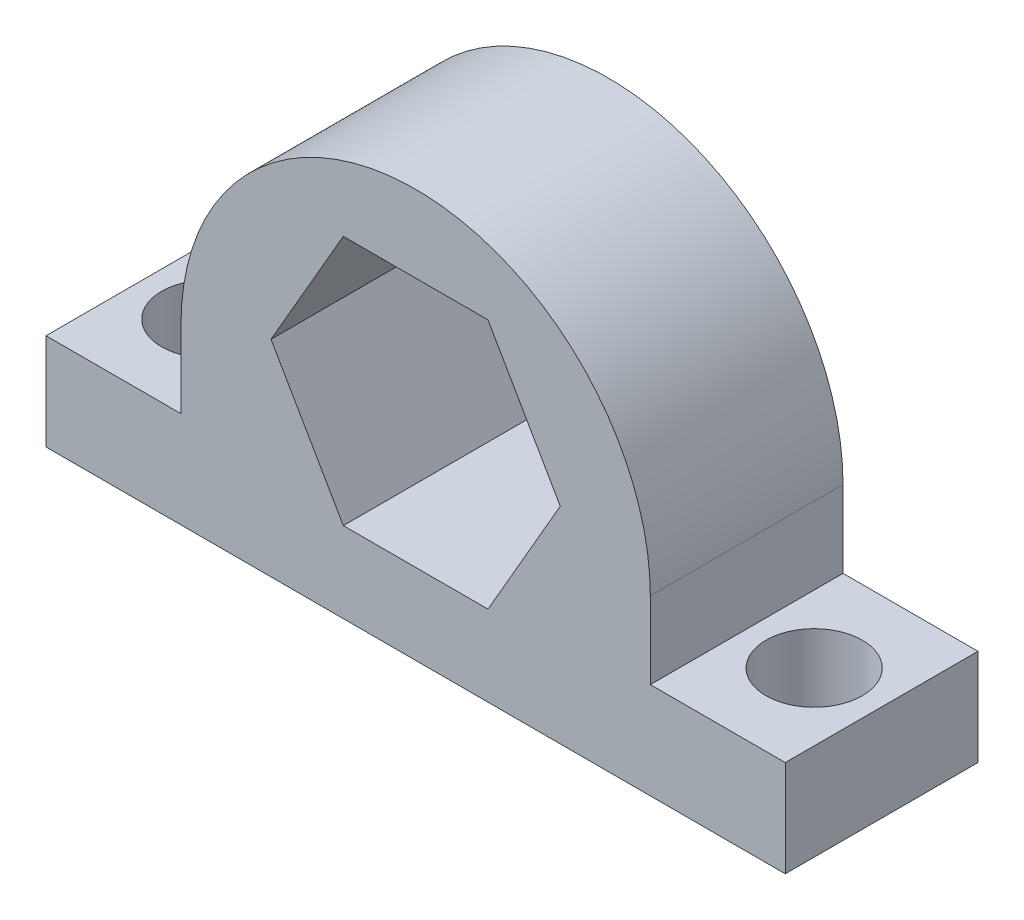
ISO-10303-21;
HEADER;
FILE_DESCRIPTION(('STEP AP214'),'2;1');
FILE_NAME('part.step','',(''),(''),'','','');
FILE_SCHEMA(('AUTOMOTIVE_DESIGN { 1 0 10303 214 1 1 1 1 }'));
ENDSEC;
DATA;
#1=APPLICATION_CONTEXT('core data for automotive mechanical design processes');
#2=APPLICATION_PROTOCOL_DEFINITION('international standard','automotive_design',2000,#1);
#3=PRODUCT_CONTEXT('',#1,'mechanical');
#4=PRODUCT('Part','Part','',(#3));
#5=PRODUCT_RELATED_PRODUCT_CATEGORY('part','',(#4));
#6=PRODUCT_DEFINITION_FORMATION('','',#4);
#7=PRODUCT_DEFINITION_CONTEXT('part definition',#1,'design');
#8=PRODUCT_DEFINITION('design','',#6,#7);
#9=PRODUCT_DEFINITION_SHAPE('','',#8);
#10=(LENGTH_UNIT() NAMED_UNIT(*) SI_UNIT(.MILLI.,.METRE.));
#11=(NAMED_UNIT(*) PLANE_ANGLE_UNIT() SI_UNIT($,.RADIAN.));
#12=(NAMED_UNIT(*) SI_UNIT($,.STERADIAN.) SOLID_ANGLE_UNIT());
#13=UNCERTAINTY_MEASURE_WITH_UNIT(LENGTH_MEASURE(1.E-05),#10,'distance_accuracy_value','');
#14=(GEOMETRIC_REPRESENTATION_CONTEXT(3) GLOBAL_UNCERTAINTY_ASSIGNED_CONTEXT((#13)) GLOBAL_UNIT_ASSIGNED_CONTEXT((#10,
#11,#12)) REPRESENTATION_CONTEXT('',''));
#15=CARTESIAN_POINT('',(0.,0.,0.));
#16=DIRECTION('',(0.,0.,1.));
#17=DIRECTION('',(1.,0.,0.));
#18=AXIS2_PLACEMENT_3D('',#15,#16,#17);
#19=CARTESIAN_POINT('',(0.,8.99563839901746,10.));
#20=DIRECTION('',(0.,0.,-1.));
#21=DIRECTION('',(-1.,0.,0.));
#22=AXIS2_PLACEMENT_3D('',#19,#20,#21);
#23=PLANE('',#22);
#24=DIRECTION('',(1.,0.,0.));
#25=VECTOR('',#24,1.);
#26=CARTESIAN_POINT('',(16.,0.,10.));
#27=LINE('',#26,#25);
#28=CARTESIAN_POINT('',(-19.18,0.,10.));
#29=VERTEX_POINT('',#28);
#30=CARTESIAN_POINT('',(19.18,0.,10.));
#31=VERTEX_POINT('',#30);
#32=EDGE_CURVE('E196',#29,#31,#27,.T.);
#33=ORIENTED_EDGE('',*,*,#32,.T.);
#34=DIRECTION('',(0.,1.,0.));
#35=VECTOR('',#34,1.);
#36=CARTESIAN_POINT('',(19.18,5.,10.));
#37=LINE('',#36,#35);
#38=CARTESIAN_POINT('',(19.18,5.,10.));
#39=VERTEX_POINT('',#38);
#40=EDGE_CURVE('E199',#31,#39,#37,.T.);
#41=ORIENTED_EDGE('',*,*,#40,.T.);
#42=DIRECTION('',(-1.,0.,0.));
#43=VECTOR('',#42,1.);
#44=CARTESIAN_POINT('',(16.,5.,10.));
#45=LINE('',#44,#43);
#46=CARTESIAN_POINT('',(12.1769911504425,5.,10.));
#47=VERTEX_POINT('',#46);
#48=EDGE_CURVE('E202',#39,#47,#45,.T.);
#49=ORIENTED_EDGE('',*,*,#48,.T.);
#50=DIRECTION('',(0.,1.,0.));
#51=VECTOR('',#50,1.);
#52=CARTESIAN_POINT('',(12.1769911504425,8.99563839901746,10.));
#53=LINE('',#52,#51);
#54=CARTESIAN_POINT('',(12.1769911504425,8.99563839901746,10.));
#55=VERTEX_POINT('',#54);
#56=EDGE_CURVE('E204',#47,#55,#53,.T.);
#57=ORIENTED_EDGE('',*,*,#56,.T.);
#58=CARTESIAN_POINT('',(0.,8.99563839901746,10.));
#59=DIRECTION('',(0.,0.,1.));
#60=DIRECTION('',(-1.,0.,0.));
#61=AXIS2_PLACEMENT_3D('',#58,#59,#60);
#62=CIRCLE('',#61,12.1769911504425);
#63=CARTESIAN_POINT('',(-12.1769911504425,8.99563839901746,10.));
#64=VERTEX_POINT('',#63);
#65=EDGE_CURVE('E206',#55,#64,#62,.T.);
#66=ORIENTED_EDGE('',*,*,#65,.T.);
#67=DIRECTION('',(0.,-1.,0.));
#68=VECTOR('',#67,1.);
#69=CARTESIAN_POINT('',(-12.1769911504425,8.99563839901746,10.));
#70=LINE('',#69,#68);
#71=CARTESIAN_POINT('',(-12.1769911504425,5.,10.));
#72=VERTEX_POINT('',#71);
#73=EDGE_CURVE('E208',#64,#72,#70,.T.);
#74=ORIENTED_EDGE('',*,*,#73,.T.);
#75=DIRECTION('',(-1.,0.,0.));
#76=VECTOR('',#75,1.);
#77=CARTESIAN_POINT('',(-16.,5.,10.));
#78=LINE('',#77,#76);
#79=CARTESIAN_POINT('',(-19.18,5.,10.));
#80=VERTEX_POINT('',#79);
#81=EDGE_CURVE('E210',#72,#80,#78,.T.);
#82=ORIENTED_EDGE('',*,*,#81,.T.);
#83=DIRECTION('',(0.,-1.,0.));
#84=VECTOR('',#83,1.);
#85=CARTESIAN_POINT('',(-19.18,0.,10.));
#86=LINE('',#85,#84);
#87=EDGE_CURVE('E212',#80,#29,#86,.T.);
#88=ORIENTED_EDGE('',*,*,#87,.T.);
#89=EDGE_LOOP('',(#33,#41,#49,#57,#66,#74,#82,#88));
#90=FACE_BOUND('',#89,.T.);
#91=DIRECTION('',(0.5,0.866025403784439,0.));
#92=VECTOR('',#91,1.);
#93=CARTESIAN_POINT('',(3.75221238938055,4.18097750080347,10.));
#94=LINE('',#93,#92);
#95=CARTESIAN_POINT('',(3.75221238938055,4.18097750080347,10.));
#96=VERTEX_POINT('',#95);
#97=CARTESIAN_POINT('',(7.5044247787611,10.68,10.));
#98=VERTEX_POINT('',#97);
#99=EDGE_CURVE('E144',#96,#98,#94,.T.);
#100=ORIENTED_EDGE('',*,*,#99,.F.);
#101=DIRECTION('',(1.,0.,0.));
#102=VECTOR('',#101,1.);
#103=CARTESIAN_POINT('',(-3.75221238938055,4.18097750080347,10.));
#104=LINE('',#103,#102);
#105=CARTESIAN_POINT('',(-3.75221238938055,4.18097750080347,10.));
#106=VERTEX_POINT('',#105);
#107=EDGE_CURVE('E174',#106,#96,#104,.T.);
#108=ORIENTED_EDGE('',*,*,#107,.F.);
#109=DIRECTION('',(0.5,-0.866025403784439,0.));
#110=VECTOR('',#109,1.);
#111=CARTESIAN_POINT('',(-7.5044247787611,10.68,10.));
#112=LINE('',#111,#110);
#113=CARTESIAN_POINT('',(-7.5044247787611,10.68,10.));
#114=VERTEX_POINT('',#113);
#115=EDGE_CURVE('E172',#114,#106,#112,.T.);
#116=ORIENTED_EDGE('',*,*,#115,.F.);
#117=DIRECTION('',(-0.5,-0.866025403784439,0.));
#118=VECTOR('',#117,1.);
#119=CARTESIAN_POINT('',(-3.75221238938055,17.1790224991965,10.));
#120=LINE('',#119,#118);
#121=CARTESIAN_POINT('',(-3.75221238938055,17.1790224991965,10.));
#122=VERTEX_POINT('',#121);
#123=EDGE_CURVE('E167',#122,#114,#120,.T.);
#124=ORIENTED_EDGE('',*,*,#123,.F.);
#125=DIRECTION('',(-1.,0.,0.));
#126=VECTOR('',#125,1.);
#127=CARTESIAN_POINT('',(3.75221238938055,17.1790224991965,10.));
#128=LINE('',#127,#126);
#129=CARTESIAN_POINT('',(3.75221238938055,17.1790224991965,10.));
#130=VERTEX_POINT('',#129);
#131=EDGE_CURVE('E165',#130,#122,#128,.T.);
#132=ORIENTED_EDGE('',*,*,#131,.F.);
#133=DIRECTION('',(-0.5,0.866025403784439,0.));
#134=VECTOR('',#133,1.);
#135=CARTESIAN_POINT('',(7.5044247787611,10.68,10.));
#136=LINE('',#135,#134);
#137=EDGE_CURVE('E152',#98,#130,#136,.T.);
#138=ORIENTED_EDGE('',*,*,#137,.F.);
#139=EDGE_LOOP('',(#100,#108,#116,#124,#132,#138));
#140=FACE_BOUND('',#139,.T.);
#141=ADVANCED_FACE('F41',(#90,#140),#23,.F.);
#142=CARTESIAN_POINT('',(0.,8.99563839901746,0.));
#143=DIRECTION('',(0.,0.,-1.));
#144=DIRECTION('',(-1.,0.,0.));
#145=AXIS2_PLACEMENT_3D('',#142,#143,#144);
#146=PLANE('',#145);
#147=DIRECTION('',(0.,1.,0.));
#148=VECTOR('',#147,1.);
#149=CARTESIAN_POINT('',(19.18,5.,0.));
#150=LINE('',#149,#148);
#151=CARTESIAN_POINT('',(19.18,0.,0.));
#152=VERTEX_POINT('',#151);
#153=CARTESIAN_POINT('',(19.18,5.,0.));
#154=VERTEX_POINT('',#153);
#155=EDGE_CURVE('E160',#152,#154,#150,.T.);
#156=ORIENTED_EDGE('',*,*,#155,.F.);
#157=DIRECTION('',(1.,0.,0.));
#158=VECTOR('',#157,1.);
#159=CARTESIAN_POINT('',(-16.,0.,0.));
#160=LINE('',#159,#158);
#161=CARTESIAN_POINT('',(-19.18,0.,0.));
#162=VERTEX_POINT('',#161);
#163=EDGE_CURVE('E200',#162,#152,#160,.T.);
#164=ORIENTED_EDGE('',*,*,#163,.F.);
#165=DIRECTION('',(0.,-1.,0.));
#166=VECTOR('',#165,1.);
#167=CARTESIAN_POINT('',(-19.18,0.,0.));
#168=LINE('',#167,#166);
#169=CARTESIAN_POINT('',(-19.18,5.,0.));
#170=VERTEX_POINT('',#169);
#171=EDGE_CURVE('E229',#170,#162,#168,.T.);
#172=ORIENTED_EDGE('',*,*,#171,.F.);
#173=DIRECTION('',(-1.,0.,0.));
#174=VECTOR('',#173,1.);
#175=CARTESIAN_POINT('',(-19.18,5.,0.));
#176=LINE('',#175,#174);
#177=CARTESIAN_POINT('',(-12.1769911504425,5.,0.));
#178=VERTEX_POINT('',#177);
#179=EDGE_CURVE('E227',#178,#170,#176,.T.);
#180=ORIENTED_EDGE('',*,*,#179,.F.);
#181=DIRECTION('',(0.,-1.,0.));
#182=VECTOR('',#181,1.);
#183=CARTESIAN_POINT('',(-12.1769911504425,8.99563839901746,0.));
#184=LINE('',#183,#182);
#185=CARTESIAN_POINT('',(-12.1769911504425,8.99563839901746,0.));
#186=VERTEX_POINT('',#185);
#187=EDGE_CURVE('E224',#186,#178,#184,.T.);
#188=ORIENTED_EDGE('',*,*,#187,.F.);
#189=CARTESIAN_POINT('',(0.,8.99563839901746,0.));
#190=DIRECTION('',(0.,0.,1.));
#191=DIRECTION('',(-1.,0.,0.));
#192=AXIS2_PLACEMENT_3D('',#189,#190,#191);
#193=CIRCLE('',#192,12.1769911504425);
#194=CARTESIAN_POINT('',(12.1769911504425,8.99563839901746,0.));
#195=VERTEX_POINT('',#194);
#196=EDGE_CURVE('E222',#195,#186,#193,.T.);
#197=ORIENTED_EDGE('',*,*,#196,.F.);
#198=DIRECTION('',(0.,1.,0.));
#199=VECTOR('',#198,1.);
#200=CARTESIAN_POINT('',(12.1769911504425,8.99563839901746,0.));
#201=LINE('',#200,#199);
#202=CARTESIAN_POINT('',(12.1769911504425,5.,0.));
#203=VERTEX_POINT('',#202);
#204=EDGE_CURVE('E220',#203,#195,#201,.T.);
#205=ORIENTED_EDGE('',*,*,#204,.F.);
#206=DIRECTION('',(-1.,0.,0.));
#207=VECTOR('',#206,1.);
#208=CARTESIAN_POINT('',(12.1769911504425,5.,0.));
#209=LINE('',#208,#207);
#210=EDGE_CURVE('E218',#154,#203,#209,.T.);
#211=ORIENTED_EDGE('',*,*,#210,.F.);
#212=EDGE_LOOP('',(#156,#164,#172,#180,#188,#197,#205,#211));
#213=FACE_BOUND('',#212,.T.);
#214=DIRECTION('',(1.,0.,0.));
#215=VECTOR('',#214,1.);
#216=CARTESIAN_POINT('',(-3.75221238938055,4.18097750080347,0.));
#217=LINE('',#216,#215);
#218=CARTESIAN_POINT('',(-3.75221238938055,4.18097750080347,0.));
#219=VERTEX_POINT('',#218);
#220=CARTESIAN_POINT('',(3.75221238938055,4.18097750080347,0.));
#221=VERTEX_POINT('',#220);
#222=EDGE_CURVE('E153',#219,#221,#217,.T.);
#223=ORIENTED_EDGE('',*,*,#222,.T.);
#224=DIRECTION('',(0.5,0.866025403784439,0.));
#225=VECTOR('',#224,1.);
#226=CARTESIAN_POINT('',(3.75221238938055,4.18097750080347,0.));
#227=LINE('',#226,#225);
#228=CARTESIAN_POINT('',(7.5044247787611,10.68,0.));
#229=VERTEX_POINT('',#228);
#230=EDGE_CURVE('E66',#221,#229,#227,.T.);
#231=ORIENTED_EDGE('',*,*,#230,.T.);
#232=DIRECTION('',(-0.5,0.866025403784439,0.));
#233=VECTOR('',#232,1.);
#234=CARTESIAN_POINT('',(7.5044247787611,10.68,0.));
#235=LINE('',#234,#233);
#236=CARTESIAN_POINT('',(3.75221238938055,17.1790224991965,0.));
#237=VERTEX_POINT('',#236);
#238=EDGE_CURVE('E159',#229,#237,#235,.T.);
#239=ORIENTED_EDGE('',*,*,#238,.T.);
#240=DIRECTION('',(-1.,0.,0.));
#241=VECTOR('',#240,1.);
#242=CARTESIAN_POINT('',(3.75221238938055,17.1790224991965,0.));
#243=LINE('',#242,#241);
#244=CARTESIAN_POINT('',(-3.75221238938055,17.1790224991965,0.));
#245=VERTEX_POINT('',#244);
#246=EDGE_CURVE('E178',#237,#245,#243,.T.);
#247=ORIENTED_EDGE('',*,*,#246,.T.);
#248=DIRECTION('',(-0.5,-0.866025403784439,0.));
#249=VECTOR('',#248,1.);
#250=CARTESIAN_POINT('',(-3.75221238938055,17.1790224991965,0.));
#251=LINE('',#250,#249);
#252=CARTESIAN_POINT('',(-7.5044247787611,10.68,0.));
#253=VERTEX_POINT('',#252);
#254=EDGE_CURVE('E181',#245,#253,#251,.T.);
#255=ORIENTED_EDGE('',*,*,#254,.T.);
#256=DIRECTION('',(0.5,-0.866025403784439,0.));
#257=VECTOR('',#256,1.);
#258=CARTESIAN_POINT('',(-7.5044247787611,10.68,0.));
#259=LINE('',#258,#257);
#260=EDGE_CURVE('E184',#253,#219,#259,.T.);
#261=ORIENTED_EDGE('',*,*,#260,.T.);
#262=EDGE_LOOP('',(#223,#231,#239,#247,#255,#261));
#263=FACE_BOUND('',#262,.T.);
#264=ADVANCED_FACE('F284',(#213,#263),#146,.T.);
#265=CARTESIAN_POINT('',(19.18,5.,10.));
#266=DIRECTION('',(-1.,0.,0.));
#267=DIRECTION('',(0.,0.,1.));
#268=AXIS2_PLACEMENT_3D('',#265,#266,#267);
#269=PLANE('',#268);
#270=ORIENTED_EDGE('',*,*,#155,.T.);
#271=DIRECTION('',(0.,0.,-1.));
#272=VECTOR('',#271,1.);
#273=CARTESIAN_POINT('',(19.18,5.,10.));
#274=LINE('',#273,#272);
#275=EDGE_CURVE('E50',#39,#154,#274,.T.);
#276=ORIENTED_EDGE('',*,*,#275,.F.);
#277=ORIENTED_EDGE('',*,*,#40,.F.);
#278=DIRECTION('',(0.,0.,-1.));
#279=VECTOR('',#278,1.);
#280=CARTESIAN_POINT('',(19.18,0.,10.));
#281=LINE('',#280,#279);
#282=EDGE_CURVE('E11',#31,#152,#281,.T.);
#283=ORIENTED_EDGE('',*,*,#282,.T.);
#284=EDGE_LOOP('',(#270,#276,#277,#283));
#285=FACE_BOUND('',#284,.T.);
#286=ADVANCED_FACE('F43',(#285),#269,.F.);
#287=CARTESIAN_POINT('',(12.1769911504425,5.,10.));
#288=DIRECTION('',(0.,-1.,0.));
#289=DIRECTION('',(0.,0.,-1.));
#290=AXIS2_PLACEMENT_3D('',#287,#288,#289);
#291=PLANE('',#290);
#292=CARTESIAN_POINT('',(15.6784955752212,5.,5.));
#293=DIRECTION('',(0.,1.,0.));
#294=DIRECTION('',(0.,0.,1.));
#295=AXIS2_PLACEMENT_3D('',#292,#293,#294);
#296=CIRCLE('',#295,2.5);
#297=CARTESIAN_POINT('',(15.6784955752212,5.,7.5));
#298=VERTEX_POINT('',#297);
#299=EDGE_CURVE('E253',#298,#298,#296,.T.);
#300=ORIENTED_EDGE('',*,*,#299,.F.);
#301=EDGE_LOOP('',(#300));
#302=FACE_BOUND('',#301,.T.);
#303=ORIENTED_EDGE('',*,*,#210,.T.);
#304=DIRECTION('',(0.,0.,-1.));
#305=VECTOR('',#304,1.);
#306=CARTESIAN_POINT('',(12.1769911504425,5.,10.));
#307=LINE('',#306,#305);
#308=EDGE_CURVE('E247',#47,#203,#307,.T.);
#309=ORIENTED_EDGE('',*,*,#308,.F.);
#310=ORIENTED_EDGE('',*,*,#48,.F.);
#311=ORIENTED_EDGE('',*,*,#275,.T.);
#312=EDGE_LOOP('',(#303,#309,#310,#311));
#313=FACE_BOUND('',#312,.T.);
#314=ADVANCED_FACE('F305',(#302,#313),#291,.F.);
#315=CARTESIAN_POINT('',(12.1769911504425,8.99563839901746,10.));
#316=DIRECTION('',(-1.,0.,0.));
#317=DIRECTION('',(0.,0.,1.));
#318=AXIS2_PLACEMENT_3D('',#315,#316,#317);
#319=PLANE('',#318);
#320=ORIENTED_EDGE('',*,*,#204,.T.);
#321=DIRECTION('',(0.,0.,-1.));
#322=VECTOR('',#321,1.);
#323=CARTESIAN_POINT('',(12.1769911504425,8.99563839901746,10.));
#324=LINE('',#323,#322);
#325=EDGE_CURVE('E244',#55,#195,#324,.T.);
#326=ORIENTED_EDGE('',*,*,#325,.F.);
#327=ORIENTED_EDGE('',*,*,#56,.F.);
#328=ORIENTED_EDGE('',*,*,#308,.T.);
#329=EDGE_LOOP('',(#320,#326,#327,#328));
#330=FACE_BOUND('',#329,.T.);
#331=ADVANCED_FACE('F301',(#330),#319,.F.);
#332=CARTESIAN_POINT('',(0.,8.99563839901746,10.));
#333=DIRECTION('',(0.,0.,-1.));
#334=DIRECTION('',(-1.,0.,0.));
#335=AXIS2_PLACEMENT_3D('',#332,#333,#334);
#336=CYLINDRICAL_SURFACE('',#335,12.1769911504425);
#337=ORIENTED_EDGE('',*,*,#196,.T.);
#338=DIRECTION('',(0.,0.,-1.));
#339=VECTOR('',#338,1.);
#340=CARTESIAN_POINT('',(-12.1769911504425,8.99563839901746,10.));
#341=LINE('',#340,#339);
#342=EDGE_CURVE('E241',#64,#186,#341,.T.);
#343=ORIENTED_EDGE('',*,*,#342,.F.);
#344=ORIENTED_EDGE('',*,*,#65,.F.);
#345=ORIENTED_EDGE('',*,*,#325,.T.);
#346=EDGE_LOOP('',(#337,#343,#344,#345));
#347=FACE_BOUND('',#346,.T.);
#348=ADVANCED_FACE('F297',(#347),#336,.T.);
#349=CARTESIAN_POINT('',(-12.1769911504425,8.99563839901746,10.));
#350=DIRECTION('',(1.,0.,0.));
#351=DIRECTION('',(0.,0.,-1.));
#352=AXIS2_PLACEMENT_3D('',#349,#350,#351);
#353=PLANE('',#352);
#354=ORIENTED_EDGE('',*,*,#187,.T.);
#355=DIRECTION('',(0.,0.,-1.));
#356=VECTOR('',#355,1.);
#357=CARTESIAN_POINT('',(-12.1769911504425,5.,10.));
#358=LINE('',#357,#356);
#359=EDGE_CURVE('E238',#72,#178,#358,.T.);
#360=ORIENTED_EDGE('',*,*,#359,.F.);
#361=ORIENTED_EDGE('',*,*,#73,.F.);
#362=ORIENTED_EDGE('',*,*,#342,.T.);
#363=EDGE_LOOP('',(#354,#360,#361,#362));
#364=FACE_BOUND('',#363,.T.);
#365=ADVANCED_FACE('F272',(#364),#353,.F.);
#366=CARTESIAN_POINT('',(-19.18,5.,10.));
#367=DIRECTION('',(0.,-1.,0.));
#368=DIRECTION('',(0.,0.,-1.));
#369=AXIS2_PLACEMENT_3D('',#366,#367,#368);
#370=PLANE('',#369);
#371=CARTESIAN_POINT('',(-15.6784955752212,5.,5.));
#372=DIRECTION('',(0.,1.,0.));
#373=DIRECTION('',(0.,0.,1.));
#374=AXIS2_PLACEMENT_3D('',#371,#372,#373);
#375=CIRCLE('',#374,2.5);
#376=CARTESIAN_POINT('',(-15.6784955752212,5.,7.5));
#377=VERTEX_POINT('',#376);
#378=EDGE_CURVE('E258',#377,#377,#375,.T.);
#379=ORIENTED_EDGE('',*,*,#378,.F.);
#380=EDGE_LOOP('',(#379));
#381=FACE_BOUND('',#380,.T.);
#382=ORIENTED_EDGE('',*,*,#179,.T.);
#383=DIRECTION('',(0.,0.,-1.));
#384=VECTOR('',#383,1.);
#385=CARTESIAN_POINT('',(-19.18,5.,10.));
#386=LINE('',#385,#384);
#387=EDGE_CURVE('E235',#80,#170,#386,.T.);
#388=ORIENTED_EDGE('',*,*,#387,.F.);
#389=ORIENTED_EDGE('',*,*,#81,.F.);
#390=ORIENTED_EDGE('',*,*,#359,.T.);
#391=EDGE_LOOP('',(#382,#388,#389,#390));
#392=FACE_BOUND('',#391,.T.);
#393=ADVANCED_FACE('F268',(#381,#392),#370,.F.);
#394=CARTESIAN_POINT('',(-19.18,0.,10.));
#395=DIRECTION('',(1.,0.,0.));
#396=DIRECTION('',(0.,0.,-1.));
#397=AXIS2_PLACEMENT_3D('',#394,#395,#396);
#398=PLANE('',#397);
#399=ORIENTED_EDGE('',*,*,#171,.T.);
#400=DIRECTION('',(0.,0.,-1.));
#401=VECTOR('',#400,1.);
#402=CARTESIAN_POINT('',(-19.18,0.,10.));
#403=LINE('',#402,#401);
#404=EDGE_CURVE('E215',#29,#162,#403,.T.);
#405=ORIENTED_EDGE('',*,*,#404,.F.);
#406=ORIENTED_EDGE('',*,*,#87,.F.);
#407=ORIENTED_EDGE('',*,*,#387,.T.);
#408=EDGE_LOOP('',(#399,#405,#406,#407));
#409=FACE_BOUND('',#408,.T.);
#410=ADVANCED_FACE('F271',(#409),#398,.F.);
#411=CARTESIAN_POINT('',(-16.,0.,10.));
#412=DIRECTION('',(0.,1.,0.));
#413=DIRECTION('',(0.,0.,1.));
#414=AXIS2_PLACEMENT_3D('',#411,#412,#413);
#415=PLANE('',#414);
#416=CARTESIAN_POINT('',(15.6784955752212,0.,5.));
#417=DIRECTION('',(0.,1.,0.));
#418=DIRECTION('',(0.,0.,1.));
#419=AXIS2_PLACEMENT_3D('',#416,#417,#418);
#420=CIRCLE('',#419,2.5);
#421=CARTESIAN_POINT('',(15.6784955752212,0.,7.5));
#422=VERTEX_POINT('',#421);
#423=EDGE_CURVE('E45',#422,#422,#420,.T.);
#424=ORIENTED_EDGE('',*,*,#423,.T.);
#425=EDGE_LOOP('',(#424));
#426=FACE_BOUND('',#425,.T.);
#427=CARTESIAN_POINT('',(-15.6784955752212,0.,5.));
#428=DIRECTION('',(0.,1.,0.));
#429=DIRECTION('',(0.,0.,1.));
#430=AXIS2_PLACEMENT_3D('',#427,#428,#429);
#431=CIRCLE('',#430,2.5);
#432=CARTESIAN_POINT('',(-15.6784955752212,0.,7.5));
#433=VERTEX_POINT('',#432);
#434=EDGE_CURVE('E251',#433,#433,#431,.T.);
#435=ORIENTED_EDGE('',*,*,#434,.T.);
#436=EDGE_LOOP('',(#435));
#437=FACE_BOUND('',#436,.T.);
#438=ORIENTED_EDGE('',*,*,#163,.T.);
#439=ORIENTED_EDGE('',*,*,#282,.F.);
#440=ORIENTED_EDGE('',*,*,#32,.F.);
#441=ORIENTED_EDGE('',*,*,#404,.T.);
#442=EDGE_LOOP('',(#438,#439,#440,#441));
#443=FACE_BOUND('',#442,.T.);
#444=ADVANCED_FACE('F288',(#426,#437,#443),#415,.F.);
#445=CARTESIAN_POINT('',(3.75221238938055,4.18097750080347,10.));
#446=DIRECTION('',(-0.866025403784439,0.5,0.));
#447=DIRECTION('',(-0.5,-0.866025403784439,0.));
#448=AXIS2_PLACEMENT_3D('',#445,#446,#447);
#449=PLANE('',#448);
#450=ORIENTED_EDGE('',*,*,#230,.F.);
#451=DIRECTION('',(0.,0.,-1.));
#452=VECTOR('',#451,1.);
#453=CARTESIAN_POINT('',(3.75221238938055,4.18097750080347,10.));
#454=LINE('',#453,#452);
#455=EDGE_CURVE('E148',#96,#221,#454,.T.);
#456=ORIENTED_EDGE('',*,*,#455,.F.);
#457=ORIENTED_EDGE('',*,*,#99,.T.);
#458=DIRECTION('',(0.,0.,-1.));
#459=VECTOR('',#458,1.);
#460=CARTESIAN_POINT('',(7.5044247787611,10.68,10.));
#461=LINE('',#460,#459);
#462=EDGE_CURVE('E147',#98,#229,#461,.T.);
#463=ORIENTED_EDGE('',*,*,#462,.T.);
#464=EDGE_LOOP('',(#450,#456,#457,#463));
#465=FACE_BOUND('',#464,.T.);
#466=ADVANCED_FACE('F146',(#465),#449,.T.);
#467=CARTESIAN_POINT('',(7.5044247787611,10.68,10.));
#468=DIRECTION('',(-0.866025403784439,-0.5,0.));
#469=DIRECTION('',(0.5,-0.866025403784439,0.));
#470=AXIS2_PLACEMENT_3D('',#467,#468,#469);
#471=PLANE('',#470);
#472=ORIENTED_EDGE('',*,*,#238,.F.);
#473=ORIENTED_EDGE('',*,*,#462,.F.);
#474=ORIENTED_EDGE('',*,*,#137,.T.);
#475=DIRECTION('',(0.,0.,-1.));
#476=VECTOR('',#475,1.);
#477=CARTESIAN_POINT('',(3.75221238938055,17.1790224991965,10.));
#478=LINE('',#477,#476);
#479=EDGE_CURVE('E161',#130,#237,#478,.T.);
#480=ORIENTED_EDGE('',*,*,#479,.T.);
#481=EDGE_LOOP('',(#472,#473,#474,#480));
#482=FACE_BOUND('',#481,.T.);
#483=ADVANCED_FACE('F156',(#482),#471,.T.);
#484=CARTESIAN_POINT('',(3.75221238938055,17.1790224991965,10.));
#485=DIRECTION('',(0.,-1.,0.));
#486=DIRECTION('',(0.,0.,-1.));
#487=AXIS2_PLACEMENT_3D('',#484,#485,#486);
#488=PLANE('',#487);
#489=ORIENTED_EDGE('',*,*,#246,.F.);
#490=ORIENTED_EDGE('',*,*,#479,.F.);
#491=ORIENTED_EDGE('',*,*,#131,.T.);
#492=DIRECTION('',(0.,0.,-1.));
#493=VECTOR('',#492,1.);
#494=CARTESIAN_POINT('',(-3.75221238938055,17.1790224991965,10.));
#495=LINE('',#494,#493);
#496=EDGE_CURVE('E193',#122,#245,#495,.T.);
#497=ORIENTED_EDGE('',*,*,#496,.T.);
#498=EDGE_LOOP('',(#489,#490,#491,#497));
#499=FACE_BOUND('',#498,.T.);
#500=ADVANCED_FACE('F368',(#499),#488,.T.);
#501=CARTESIAN_POINT('',(-3.75221238938055,17.1790224991965,10.));
#502=DIRECTION('',(0.866025403784439,-0.5,0.));
#503=DIRECTION('',(0.5,0.866025403784439,0.));
#504=AXIS2_PLACEMENT_3D('',#501,#502,#503);
#505=PLANE('',#504);
#506=ORIENTED_EDGE('',*,*,#254,.F.);
#507=ORIENTED_EDGE('',*,*,#496,.F.);
#508=ORIENTED_EDGE('',*,*,#123,.T.);
#509=DIRECTION('',(0.,0.,-1.));
#510=VECTOR('',#509,1.);
#511=CARTESIAN_POINT('',(-7.5044247787611,10.68,10.));
#512=LINE('',#511,#510);
#513=EDGE_CURVE('E191',#114,#253,#512,.T.);
#514=ORIENTED_EDGE('',*,*,#513,.T.);
#515=EDGE_LOOP('',(#506,#507,#508,#514));
#516=FACE_BOUND('',#515,.T.);
#517=ADVANCED_FACE('F374',(#516),#505,.T.);
#518=CARTESIAN_POINT('',(-7.5044247787611,10.68,10.));
#519=DIRECTION('',(0.866025403784439,0.5,0.));
#520=DIRECTION('',(-0.5,0.866025403784439,0.));
#521=AXIS2_PLACEMENT_3D('',#518,#519,#520);
#522=PLANE('',#521);
#523=ORIENTED_EDGE('',*,*,#260,.F.);
#524=ORIENTED_EDGE('',*,*,#513,.F.);
#525=ORIENTED_EDGE('',*,*,#115,.T.);
#526=DIRECTION('',(0.,0.,-1.));
#527=VECTOR('',#526,1.);
#528=CARTESIAN_POINT('',(-3.75221238938055,4.18097750080347,10.));
#529=LINE('',#528,#527);
#530=EDGE_CURVE('E58',#106,#219,#529,.T.);
#531=ORIENTED_EDGE('',*,*,#530,.T.);
#532=EDGE_LOOP('',(#523,#524,#525,#531));
#533=FACE_BOUND('',#532,.T.);
#534=ADVANCED_FACE('F382',(#533),#522,.T.);
#535=CARTESIAN_POINT('',(-3.75221238938055,4.18097750080347,10.));
#536=DIRECTION('',(0.,1.,0.));
#537=DIRECTION('',(-1.,0.,0.));
#538=AXIS2_PLACEMENT_3D('',#535,#536,#537);
#539=PLANE('',#538);
#540=ORIENTED_EDGE('',*,*,#222,.F.);
#541=ORIENTED_EDGE('',*,*,#530,.F.);
#542=ORIENTED_EDGE('',*,*,#107,.T.);
#543=ORIENTED_EDGE('',*,*,#455,.T.);
#544=EDGE_LOOP('',(#540,#541,#542,#543));
#545=FACE_BOUND('',#544,.T.);
#546=ADVANCED_FACE('F390',(#545),#539,.T.);
#547=CARTESIAN_POINT('',(-15.6784955752212,-5.,5.));
#548=DIRECTION('',(0.,1.,0.));
#549=DIRECTION('',(0.,0.,1.));
#550=AXIS2_PLACEMENT_3D('',#547,#548,#549);
#551=CYLINDRICAL_SURFACE('',#550,2.5);
#552=ORIENTED_EDGE('',*,*,#378,.T.);
#553=EDGE_LOOP('',(#552));
#554=FACE_BOUND('',#553,.T.);
#555=ORIENTED_EDGE('',*,*,#434,.F.);
#556=EDGE_LOOP('',(#555));
#557=FACE_BOUND('',#556,.T.);
#558=ADVANCED_FACE('F265',(#554,#557),#551,.F.);
#559=CARTESIAN_POINT('',(15.6784955752212,-5.,5.));
#560=DIRECTION('',(0.,1.,0.));
#561=DIRECTION('',(0.,0.,1.));
#562=AXIS2_PLACEMENT_3D('',#559,#560,#561);
#563=CYLINDRICAL_SURFACE('',#562,2.5);
#564=ORIENTED_EDGE('',*,*,#299,.T.);
#565=EDGE_LOOP('',(#564));
#566=FACE_BOUND('',#565,.T.);
#567=ORIENTED_EDGE('',*,*,#423,.F.);
#568=EDGE_LOOP('',(#567));
#569=FACE_BOUND('',#568,.T.);
#570=ADVANCED_FACE('F403',(#566,#569),#563,.F.);
#571=CLOSED_SHELL('',(#141,#264,#286,#314,#331,#348,#365,#393,#410,#444,#466,#483,#500,#517,
#534,#546,#558,#570));
#572=MANIFOLD_SOLID_BREP('B2',#571);
#573=ADVANCED_BREP_SHAPE_REPRESENTATION('',(#18,#572),#14);
#574=SHAPE_DEFINITION_REPRESENTATION(#9,#573);
ENDSEC;
END-ISO-10303-21;
